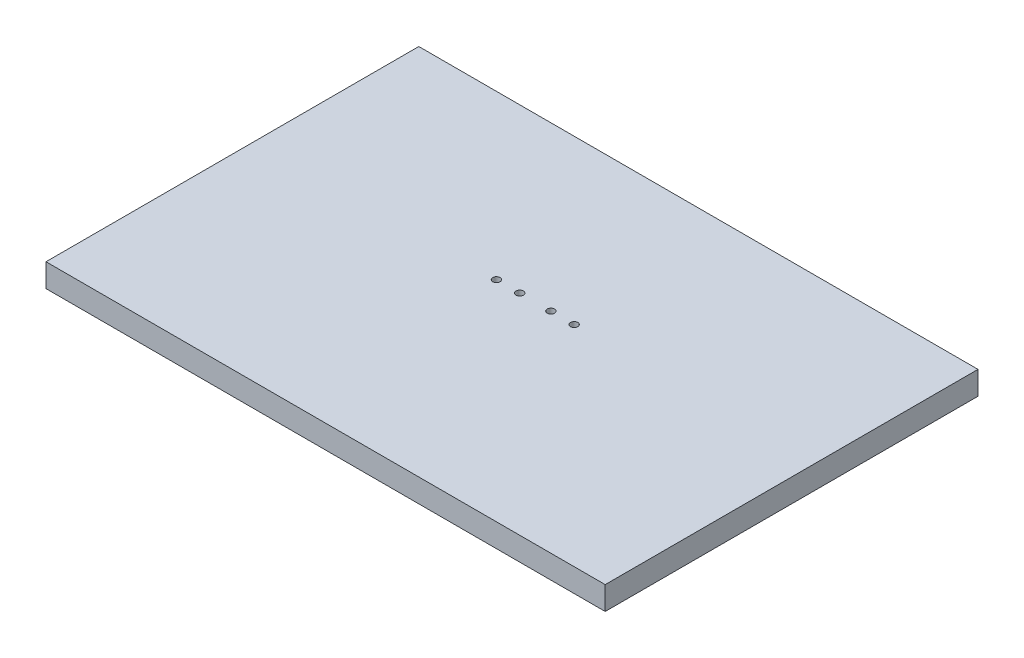
ISO-10303-21;
HEADER;
FILE_DESCRIPTION(('STEP AP214'),'2;1');
FILE_NAME('part.step','',(''),(''),'','','');
FILE_SCHEMA(('AUTOMOTIVE_DESIGN { 1 0 10303 214 1 1 1 1 }'));
ENDSEC;
DATA;
#1=APPLICATION_CONTEXT('core data for automotive mechanical design processes');
#2=APPLICATION_PROTOCOL_DEFINITION('international standard','automotive_design',2000,#1);
#3=PRODUCT_CONTEXT('',#1,'mechanical');
#4=PRODUCT('Part','Part','',(#3));
#5=PRODUCT_RELATED_PRODUCT_CATEGORY('part','',(#4));
#6=PRODUCT_DEFINITION_FORMATION('','',#4);
#7=PRODUCT_DEFINITION_CONTEXT('part definition',#1,'design');
#8=PRODUCT_DEFINITION('design','',#6,#7);
#9=PRODUCT_DEFINITION_SHAPE('','',#8);
#10=(LENGTH_UNIT() NAMED_UNIT(*) SI_UNIT(.MILLI.,.METRE.));
#11=(NAMED_UNIT(*) PLANE_ANGLE_UNIT() SI_UNIT($,.RADIAN.));
#12=(NAMED_UNIT(*) SI_UNIT($,.STERADIAN.) SOLID_ANGLE_UNIT());
#13=UNCERTAINTY_MEASURE_WITH_UNIT(LENGTH_MEASURE(1.E-05),#10,'distance_accuracy_value','');
#14=(GEOMETRIC_REPRESENTATION_CONTEXT(3) GLOBAL_UNCERTAINTY_ASSIGNED_CONTEXT((#13)) GLOBAL_UNIT_ASSIGNED_CONTEXT((#10,
#11,#12)) REPRESENTATION_CONTEXT('',''));
#15=CARTESIAN_POINT('',(0.,0.,0.));
#16=DIRECTION('',(0.,0.,1.));
#17=DIRECTION('',(1.,0.,0.));
#18=AXIS2_PLACEMENT_3D('',#15,#16,#17);
#19=CARTESIAN_POINT('',(152.4,12.7,101.6));
#20=DIRECTION('',(-1.,0.,0.));
#21=DIRECTION('',(0.,0.,1.));
#22=AXIS2_PLACEMENT_3D('',#19,#20,#21);
#23=PLANE('',#22);
#24=DIRECTION('',(0.,0.,-1.));
#25=VECTOR('',#24,1.);
#26=CARTESIAN_POINT('',(152.4,0.,101.6));
#27=LINE('',#26,#25);
#28=CARTESIAN_POINT('',(152.4,0.,101.6));
#29=VERTEX_POINT('',#28);
#30=CARTESIAN_POINT('',(152.4,0.,-101.6));
#31=VERTEX_POINT('',#30);
#32=EDGE_CURVE('E96',#29,#31,#27,.T.);
#33=ORIENTED_EDGE('',*,*,#32,.T.);
#34=DIRECTION('',(0.,-1.,0.));
#35=VECTOR('',#34,1.);
#36=CARTESIAN_POINT('',(152.4,12.7,-101.6));
#37=LINE('',#36,#35);
#38=CARTESIAN_POINT('',(152.4,12.7,-101.6));
#39=VERTEX_POINT('',#38);
#40=EDGE_CURVE('E11',#39,#31,#37,.T.);
#41=ORIENTED_EDGE('',*,*,#40,.F.);
#42=DIRECTION('',(0.,0.,-1.));
#43=VECTOR('',#42,1.);
#44=CARTESIAN_POINT('',(152.4,12.7,101.6));
#45=LINE('',#44,#43);
#46=CARTESIAN_POINT('',(152.4,12.7,101.6));
#47=VERTEX_POINT('',#46);
#48=EDGE_CURVE('E84',#47,#39,#45,.T.);
#49=ORIENTED_EDGE('',*,*,#48,.F.);
#50=DIRECTION('',(0.,-1.,0.));
#51=VECTOR('',#50,1.);
#52=CARTESIAN_POINT('',(152.4,12.7,101.6));
#53=LINE('',#52,#51);
#54=EDGE_CURVE('E92',#47,#29,#53,.T.);
#55=ORIENTED_EDGE('',*,*,#54,.T.);
#56=EDGE_LOOP('',(#33,#41,#49,#55));
#57=FACE_BOUND('',#56,.T.);
#58=ADVANCED_FACE('F33',(#57),#23,.F.);
#59=CARTESIAN_POINT('',(-152.4,12.7,-101.6));
#60=DIRECTION('',(0.,0.,1.));
#61=DIRECTION('',(1.,0.,0.));
#62=AXIS2_PLACEMENT_3D('',#59,#60,#61);
#63=PLANE('',#62);
#64=DIRECTION('',(-1.,0.,0.));
#65=VECTOR('',#64,1.);
#66=CARTESIAN_POINT('',(-152.4,0.,-101.6));
#67=LINE('',#66,#65);
#68=CARTESIAN_POINT('',(-152.4,0.,-101.6));
#69=VERTEX_POINT('',#68);
#70=EDGE_CURVE('E88',#31,#69,#67,.T.);
#71=ORIENTED_EDGE('',*,*,#70,.T.);
#72=DIRECTION('',(0.,-1.,0.));
#73=VECTOR('',#72,1.);
#74=CARTESIAN_POINT('',(-152.4,12.7,-101.6));
#75=LINE('',#74,#73);
#76=CARTESIAN_POINT('',(-152.4,12.7,-101.6));
#77=VERTEX_POINT('',#76);
#78=EDGE_CURVE('E41',#77,#69,#75,.T.);
#79=ORIENTED_EDGE('',*,*,#78,.F.);
#80=DIRECTION('',(-1.,0.,0.));
#81=VECTOR('',#80,1.);
#82=CARTESIAN_POINT('',(-152.4,12.7,-101.6));
#83=LINE('',#82,#81);
#84=EDGE_CURVE('E79',#39,#77,#83,.T.);
#85=ORIENTED_EDGE('',*,*,#84,.F.);
#86=ORIENTED_EDGE('',*,*,#40,.T.);
#87=EDGE_LOOP('',(#71,#79,#85,#86));
#88=FACE_BOUND('',#87,.T.);
#89=ADVANCED_FACE('F87',(#88),#63,.F.);
#90=CARTESIAN_POINT('',(-152.4,12.7,101.6));
#91=DIRECTION('',(1.,0.,0.));
#92=DIRECTION('',(0.,0.,-1.));
#93=AXIS2_PLACEMENT_3D('',#90,#91,#92);
#94=PLANE('',#93);
#95=DIRECTION('',(0.,0.,1.));
#96=VECTOR('',#95,1.);
#97=CARTESIAN_POINT('',(-152.4,0.,101.6));
#98=LINE('',#97,#96);
#99=CARTESIAN_POINT('',(-152.4,0.,101.6));
#100=VERTEX_POINT('',#99);
#101=EDGE_CURVE('E66',#69,#100,#98,.T.);
#102=ORIENTED_EDGE('',*,*,#101,.T.);
#103=DIRECTION('',(0.,-1.,0.));
#104=VECTOR('',#103,1.);
#105=CARTESIAN_POINT('',(-152.4,12.7,101.6));
#106=LINE('',#105,#104);
#107=CARTESIAN_POINT('',(-152.4,12.7,101.6));
#108=VERTEX_POINT('',#107);
#109=EDGE_CURVE('E89',#108,#100,#106,.T.);
#110=ORIENTED_EDGE('',*,*,#109,.F.);
#111=DIRECTION('',(0.,0.,1.));
#112=VECTOR('',#111,1.);
#113=CARTESIAN_POINT('',(-152.4,12.7,101.6));
#114=LINE('',#113,#112);
#115=EDGE_CURVE('E82',#77,#108,#114,.T.);
#116=ORIENTED_EDGE('',*,*,#115,.F.);
#117=ORIENTED_EDGE('',*,*,#78,.T.);
#118=EDGE_LOOP('',(#102,#110,#116,#117));
#119=FACE_BOUND('',#118,.T.);
#120=ADVANCED_FACE('F90',(#119),#94,.F.);
#121=CARTESIAN_POINT('',(-152.4,12.7,101.6));
#122=DIRECTION('',(0.,0.,-1.));
#123=DIRECTION('',(-1.,0.,0.));
#124=AXIS2_PLACEMENT_3D('',#121,#122,#123);
#125=PLANE('',#124);
#126=DIRECTION('',(1.,0.,0.));
#127=VECTOR('',#126,1.);
#128=CARTESIAN_POINT('',(-152.4,0.,101.6));
#129=LINE('',#128,#127);
#130=EDGE_CURVE('E72',#100,#29,#129,.T.);
#131=ORIENTED_EDGE('',*,*,#130,.T.);
#132=ORIENTED_EDGE('',*,*,#54,.F.);
#133=DIRECTION('',(1.,0.,0.));
#134=VECTOR('',#133,1.);
#135=CARTESIAN_POINT('',(-152.4,12.7,101.6));
#136=LINE('',#135,#134);
#137=EDGE_CURVE('E49',#108,#47,#136,.T.);
#138=ORIENTED_EDGE('',*,*,#137,.F.);
#139=ORIENTED_EDGE('',*,*,#109,.T.);
#140=EDGE_LOOP('',(#131,#132,#138,#139));
#141=FACE_BOUND('',#140,.T.);
#142=ADVANCED_FACE('F104',(#141),#125,.F.);
#143=CARTESIAN_POINT('',(0.,12.7,0.));
#144=DIRECTION('',(0.,-1.,0.));
#145=DIRECTION('',(0.,0.,-1.));
#146=AXIS2_PLACEMENT_3D('',#143,#144,#145);
#147=PLANE('',#146);
#148=CARTESIAN_POINT('',(-21.2,12.7,-12.7));
#149=DIRECTION('',(0.,1.,0.));
#150=DIRECTION('',(0.,0.,1.));
#151=AXIS2_PLACEMENT_3D('',#148,#149,#150);
#152=CIRCLE('',#151,2.);
#153=CARTESIAN_POINT('',(-21.2,12.7,-10.7));
#154=VERTEX_POINT('',#153);
#155=EDGE_CURVE('E123',#154,#154,#152,.T.);
#156=ORIENTED_EDGE('',*,*,#155,.F.);
#157=EDGE_LOOP('',(#156));
#158=FACE_BOUND('',#157,.T.);
#159=CARTESIAN_POINT('',(8.5,12.7,-12.7));
#160=DIRECTION('',(0.,1.,0.));
#161=DIRECTION('',(0.,0.,-1.));
#162=AXIS2_PLACEMENT_3D('',#159,#160,#161);
#163=CIRCLE('',#162,2.);
#164=CARTESIAN_POINT('',(8.5,12.7,-14.7));
#165=VERTEX_POINT('',#164);
#166=EDGE_CURVE('E124',#165,#165,#163,.T.);
#167=ORIENTED_EDGE('',*,*,#166,.F.);
#168=EDGE_LOOP('',(#167));
#169=FACE_BOUND('',#168,.T.);
#170=CARTESIAN_POINT('',(21.2,12.7,-12.7));
#171=DIRECTION('',(0.,1.,0.));
#172=DIRECTION('',(0.,0.,-1.));
#173=AXIS2_PLACEMENT_3D('',#170,#171,#172);
#174=CIRCLE('',#173,2.);
#175=CARTESIAN_POINT('',(21.2,12.7,-14.7));
#176=VERTEX_POINT('',#175);
#177=EDGE_CURVE('E110',#176,#176,#174,.T.);
#178=ORIENTED_EDGE('',*,*,#177,.F.);
#179=EDGE_LOOP('',(#178));
#180=FACE_BOUND('',#179,.T.);
#181=CARTESIAN_POINT('',(-8.5,12.7,-12.7));
#182=DIRECTION('',(0.,1.,0.));
#183=DIRECTION('',(0.,0.,1.));
#184=AXIS2_PLACEMENT_3D('',#181,#182,#183);
#185=CIRCLE('',#184,2.);
#186=CARTESIAN_POINT('',(-8.5,12.7,-10.7));
#187=VERTEX_POINT('',#186);
#188=EDGE_CURVE('E117',#187,#187,#185,.T.);
#189=ORIENTED_EDGE('',*,*,#188,.F.);
#190=EDGE_LOOP('',(#189));
#191=FACE_BOUND('',#190,.T.);
#192=ORIENTED_EDGE('',*,*,#48,.T.);
#193=ORIENTED_EDGE('',*,*,#84,.T.);
#194=ORIENTED_EDGE('',*,*,#115,.T.);
#195=ORIENTED_EDGE('',*,*,#137,.T.);
#196=EDGE_LOOP('',(#192,#193,#194,#195));
#197=FACE_BOUND('',#196,.T.);
#198=ADVANCED_FACE('F80',(#158,#169,#180,#191,#197),#147,.F.);
#199=CARTESIAN_POINT('',(0.,0.,0.));
#200=DIRECTION('',(0.,-1.,0.));
#201=DIRECTION('',(0.,0.,-1.));
#202=AXIS2_PLACEMENT_3D('',#199,#200,#201);
#203=PLANE('',#202);
#204=CARTESIAN_POINT('',(-21.2,0.,-12.7));
#205=DIRECTION('',(0.,1.,0.));
#206=DIRECTION('',(0.,0.,1.));
#207=AXIS2_PLACEMENT_3D('',#204,#205,#206);
#208=CIRCLE('',#207,2.);
#209=CARTESIAN_POINT('',(-21.2,0.,-10.7));
#210=VERTEX_POINT('',#209);
#211=EDGE_CURVE('E99',#210,#210,#208,.T.);
#212=ORIENTED_EDGE('',*,*,#211,.T.);
#213=EDGE_LOOP('',(#212));
#214=FACE_BOUND('',#213,.T.);
#215=CARTESIAN_POINT('',(8.5,0.,-12.7));
#216=DIRECTION('',(0.,1.,0.));
#217=DIRECTION('',(0.,0.,-1.));
#218=AXIS2_PLACEMENT_3D('',#215,#216,#217);
#219=CIRCLE('',#218,2.);
#220=CARTESIAN_POINT('',(8.5,0.,-14.7));
#221=VERTEX_POINT('',#220);
#222=EDGE_CURVE('E114',#221,#221,#219,.T.);
#223=ORIENTED_EDGE('',*,*,#222,.T.);
#224=EDGE_LOOP('',(#223));
#225=FACE_BOUND('',#224,.T.);
#226=CARTESIAN_POINT('',(21.2,0.,-12.7));
#227=DIRECTION('',(0.,1.,0.));
#228=DIRECTION('',(0.,0.,-1.));
#229=AXIS2_PLACEMENT_3D('',#226,#227,#228);
#230=CIRCLE('',#229,2.);
#231=CARTESIAN_POINT('',(21.2,0.,-14.7));
#232=VERTEX_POINT('',#231);
#233=EDGE_CURVE('E113',#232,#232,#230,.T.);
#234=ORIENTED_EDGE('',*,*,#233,.T.);
#235=EDGE_LOOP('',(#234));
#236=FACE_BOUND('',#235,.T.);
#237=CARTESIAN_POINT('',(-8.5,0.,-12.7));
#238=DIRECTION('',(0.,1.,0.));
#239=DIRECTION('',(0.,0.,1.));
#240=AXIS2_PLACEMENT_3D('',#237,#238,#239);
#241=CIRCLE('',#240,2.);
#242=CARTESIAN_POINT('',(-8.5,0.,-10.7));
#243=VERTEX_POINT('',#242);
#244=EDGE_CURVE('E120',#243,#243,#241,.T.);
#245=ORIENTED_EDGE('',*,*,#244,.T.);
#246=EDGE_LOOP('',(#245));
#247=FACE_BOUND('',#246,.T.);
#248=ORIENTED_EDGE('',*,*,#32,.F.);
#249=ORIENTED_EDGE('',*,*,#130,.F.);
#250=ORIENTED_EDGE('',*,*,#101,.F.);
#251=ORIENTED_EDGE('',*,*,#70,.F.);
#252=EDGE_LOOP('',(#248,#249,#250,#251));
#253=FACE_BOUND('',#252,.T.);
#254=ADVANCED_FACE('F107',(#214,#225,#236,#247,#253),#203,.T.);
#255=CARTESIAN_POINT('',(-8.5,0.,-12.7));
#256=DIRECTION('',(0.,1.,0.));
#257=DIRECTION('',(0.,0.,1.));
#258=AXIS2_PLACEMENT_3D('',#255,#256,#257);
#259=CYLINDRICAL_SURFACE('',#258,2.);
#260=ORIENTED_EDGE('',*,*,#244,.F.);
#261=EDGE_LOOP('',(#260));
#262=FACE_BOUND('',#261,.T.);
#263=ORIENTED_EDGE('',*,*,#188,.T.);
#264=EDGE_LOOP('',(#263));
#265=FACE_BOUND('',#264,.T.);
#266=ADVANCED_FACE('F152',(#262,#265),#259,.F.);
#267=CARTESIAN_POINT('',(21.2,0.,-12.7));
#268=DIRECTION('',(0.,1.,0.));
#269=DIRECTION('',(0.,0.,1.));
#270=AXIS2_PLACEMENT_3D('',#267,#268,#269);
#271=CYLINDRICAL_SURFACE('',#270,2.);
#272=ORIENTED_EDGE('',*,*,#233,.F.);
#273=EDGE_LOOP('',(#272));
#274=FACE_BOUND('',#273,.T.);
#275=ORIENTED_EDGE('',*,*,#177,.T.);
#276=EDGE_LOOP('',(#275));
#277=FACE_BOUND('',#276,.T.);
#278=ADVANCED_FACE('F154',(#274,#277),#271,.F.);
#279=CARTESIAN_POINT('',(8.5,0.,-12.7));
#280=DIRECTION('',(0.,1.,0.));
#281=DIRECTION('',(0.,0.,1.));
#282=AXIS2_PLACEMENT_3D('',#279,#280,#281);
#283=CYLINDRICAL_SURFACE('',#282,2.);
#284=ORIENTED_EDGE('',*,*,#222,.F.);
#285=EDGE_LOOP('',(#284));
#286=FACE_BOUND('',#285,.T.);
#287=ORIENTED_EDGE('',*,*,#166,.T.);
#288=EDGE_LOOP('',(#287));
#289=FACE_BOUND('',#288,.T.);
#290=ADVANCED_FACE('F139',(#286,#289),#283,.F.);
#291=CARTESIAN_POINT('',(-21.2,0.,-12.7));
#292=DIRECTION('',(0.,1.,0.));
#293=DIRECTION('',(0.,0.,1.));
#294=AXIS2_PLACEMENT_3D('',#291,#292,#293);
#295=CYLINDRICAL_SURFACE('',#294,2.);
#296=ORIENTED_EDGE('',*,*,#211,.F.);
#297=EDGE_LOOP('',(#296));
#298=FACE_BOUND('',#297,.T.);
#299=ORIENTED_EDGE('',*,*,#155,.T.);
#300=EDGE_LOOP('',(#299));
#301=FACE_BOUND('',#300,.T.);
#302=ADVANCED_FACE('F136',(#298,#301),#295,.F.);
#303=CLOSED_SHELL('',(#58,#89,#120,#142,#198,#254,#266,#278,#290,#302));
#304=MANIFOLD_SOLID_BREP('B2',#303);
#305=ADVANCED_BREP_SHAPE_REPRESENTATION('',(#18,#304),#14);
#306=SHAPE_DEFINITION_REPRESENTATION(#9,#305);
ENDSEC;
END-ISO-10303-21;
